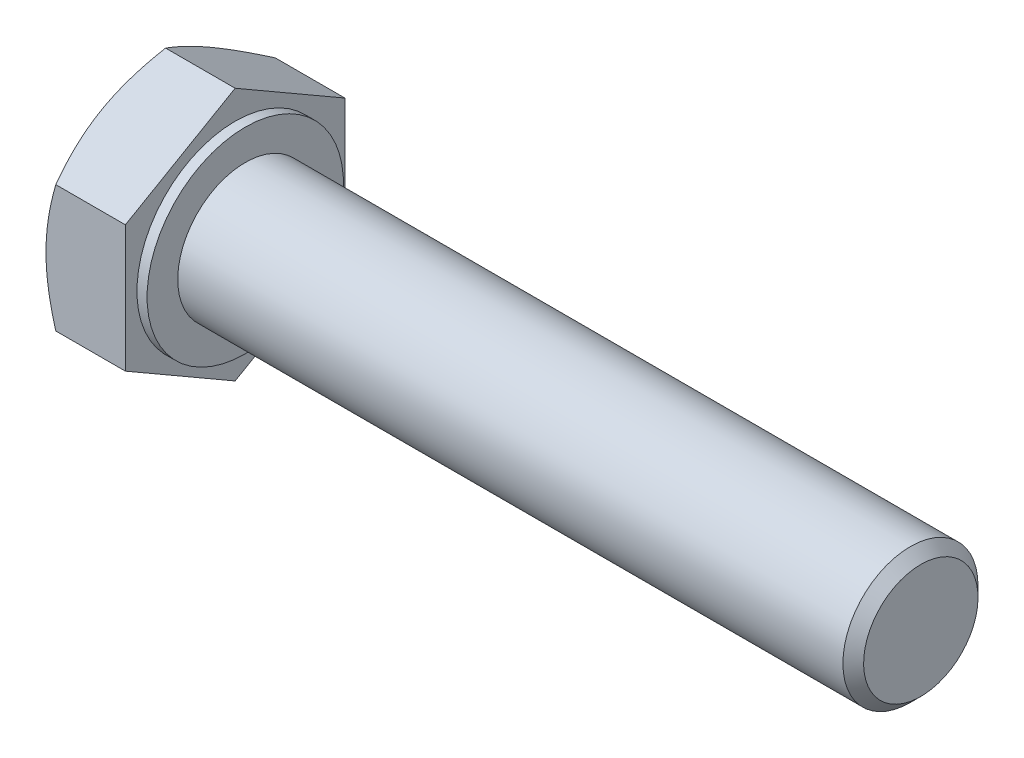
ISO-10303-21;
HEADER;
FILE_DESCRIPTION(('STEP AP214'),'2;1');
FILE_NAME('part.step','',(''),(''),'','','');
FILE_SCHEMA(('AUTOMOTIVE_DESIGN { 1 0 10303 214 1 1 1 1 }'));
ENDSEC;
DATA;
#1=APPLICATION_CONTEXT('core data for automotive mechanical design processes');
#2=APPLICATION_PROTOCOL_DEFINITION('international standard','automotive_design',2000,#1);
#3=PRODUCT_CONTEXT('',#1,'mechanical');
#4=PRODUCT('Part','Part','',(#3));
#5=PRODUCT_RELATED_PRODUCT_CATEGORY('part','',(#4));
#6=PRODUCT_DEFINITION_FORMATION('','',#4);
#7=PRODUCT_DEFINITION_CONTEXT('part definition',#1,'design');
#8=PRODUCT_DEFINITION('design','',#6,#7);
#9=PRODUCT_DEFINITION_SHAPE('','',#8);
#10=(LENGTH_UNIT() NAMED_UNIT(*) SI_UNIT(.MILLI.,.METRE.));
#11=(NAMED_UNIT(*) PLANE_ANGLE_UNIT() SI_UNIT($,.RADIAN.));
#12=(NAMED_UNIT(*) SI_UNIT($,.STERADIAN.) SOLID_ANGLE_UNIT());
#13=UNCERTAINTY_MEASURE_WITH_UNIT(LENGTH_MEASURE(1.E-05),#10,'distance_accuracy_value','');
#14=(GEOMETRIC_REPRESENTATION_CONTEXT(3) GLOBAL_UNCERTAINTY_ASSIGNED_CONTEXT((#13)) GLOBAL_UNIT_ASSIGNED_CONTEXT((#10,
#11,#12)) REPRESENTATION_CONTEXT('',''));
#15=CARTESIAN_POINT('',(0.,0.,0.));
#16=DIRECTION('',(0.,0.,1.));
#17=DIRECTION('',(1.,0.,0.));
#18=AXIS2_PLACEMENT_3D('',#15,#16,#17);
#19=CARTESIAN_POINT('',(0.,4.9075,0.));
#20=DIRECTION('',(1.,0.,0.));
#21=DIRECTION('',(0.,1.,0.));
#22=AXIS2_PLACEMENT_3D('',#19,#20,#21);
#23=PLANE('',#22);
#24=CARTESIAN_POINT('',(0.,0.,0.));
#25=DIRECTION('',(1.,0.,0.));
#26=DIRECTION('',(0.,1.,0.));
#27=AXIS2_PLACEMENT_3D('',#24,#25,#26);
#28=CIRCLE('',#27,4.);
#29=CARTESIAN_POINT('',(0.,-4.,0.));
#30=VERTEX_POINT('',#29);
#31=EDGE_CURVE('E92',#30,#30,#28,.T.);
#32=ORIENTED_EDGE('',*,*,#31,.F.);
#33=EDGE_LOOP('',(#32));
#34=FACE_BOUND('',#33,.T.);
#35=CARTESIAN_POINT('',(0.,0.,0.));
#36=DIRECTION('',(1.,0.,0.));
#37=DIRECTION('',(0.,1.,0.));
#38=AXIS2_PLACEMENT_3D('',#35,#36,#37);
#39=CIRCLE('',#38,5.815);
#40=CARTESIAN_POINT('',(0.,-5.815,0.));
#41=VERTEX_POINT('',#40);
#42=EDGE_CURVE('E28',#41,#41,#39,.T.);
#43=ORIENTED_EDGE('',*,*,#42,.T.);
#44=EDGE_LOOP('',(#43));
#45=FACE_BOUND('',#44,.T.);
#46=ADVANCED_FACE('F17',(#34,#45),#23,.T.);
#47=CARTESIAN_POINT('',(-0.300049999999992,0.,0.));
#48=DIRECTION('',(1.,0.,0.));
#49=DIRECTION('',(0.,1.,0.));
#50=AXIS2_PLACEMENT_3D('',#47,#48,#49);
#51=CYLINDRICAL_SURFACE('',#50,5.815);
#52=ORIENTED_EDGE('',*,*,#42,.F.);
#53=DIRECTION('',(-1.,0.,0.));
#54=VECTOR('',#53,1.);
#55=CARTESIAN_POINT('',(-0.300049999999992,-5.815,0.));
#56=LINE('',#55,#54);
#57=CARTESIAN_POINT('',(-0.600099999999993,-5.815,0.));
#58=VERTEX_POINT('',#57);
#59=EDGE_CURVE('E11',#41,#58,#56,.T.);
#60=ORIENTED_EDGE('',*,*,#59,.T.);
#61=CARTESIAN_POINT('',(-0.600099999999992,0.,0.));
#62=DIRECTION('',(1.,0.,0.));
#63=DIRECTION('',(0.,1.,0.));
#64=AXIS2_PLACEMENT_3D('',#61,#62,#63);
#65=CIRCLE('',#64,5.815);
#66=EDGE_CURVE('E131',#58,#58,#65,.T.);
#67=ORIENTED_EDGE('',*,*,#66,.T.);
#68=ORIENTED_EDGE('',*,*,#59,.F.);
#69=EDGE_LOOP('',(#52,#60,#67,#68));
#70=FACE_BOUND('',#69,.T.);
#71=ADVANCED_FACE('F378',(#70),#51,.T.);
#72=CARTESIAN_POINT('',(-5.3001,0.,0.));
#73=DIRECTION('',(1.,0.,0.));
#74=DIRECTION('',(0.,1.,0.));
#75=AXIS2_PLACEMENT_3D('',#72,#73,#74);
#76=PLANE('',#75);
#77=CARTESIAN_POINT('',(-5.3001,0.,0.));
#78=DIRECTION('',(-1.,0.,0.));
#79=DIRECTION('',(0.,1.,0.));
#80=AXIS2_PLACEMENT_3D('',#77,#78,#79);
#81=CIRCLE('',#80,6.5);
#82=CARTESIAN_POINT('',(-5.3001,0.,6.5));
#83=VERTEX_POINT('',#82);
#84=CARTESIAN_POINT('',(-5.3001,5.62916512459884,3.25));
#85=VERTEX_POINT('',#84);
#86=EDGE_CURVE('E192',#83,#85,#81,.T.);
#87=ORIENTED_EDGE('',*,*,#86,.T.);
#88=CARTESIAN_POINT('',(-5.3001,0.,0.));
#89=DIRECTION('',(-1.,0.,0.));
#90=DIRECTION('',(0.,1.,0.));
#91=AXIS2_PLACEMENT_3D('',#88,#89,#90);
#92=CIRCLE('',#91,6.5);
#93=CARTESIAN_POINT('',(-5.3001,5.62916512459885,-3.25));
#94=VERTEX_POINT('',#93);
#95=EDGE_CURVE('E124',#85,#94,#92,.T.);
#96=ORIENTED_EDGE('',*,*,#95,.T.);
#97=CARTESIAN_POINT('',(-5.3001,0.,0.));
#98=DIRECTION('',(-1.,0.,0.));
#99=DIRECTION('',(0.,1.,0.));
#100=AXIS2_PLACEMENT_3D('',#97,#98,#99);
#101=CIRCLE('',#100,6.5);
#102=CARTESIAN_POINT('',(-5.3001,0.,-6.5));
#103=VERTEX_POINT('',#102);
#104=EDGE_CURVE('E161',#94,#103,#101,.T.);
#105=ORIENTED_EDGE('',*,*,#104,.T.);
#106=CARTESIAN_POINT('',(-5.3001,0.,0.));
#107=DIRECTION('',(-1.,0.,0.));
#108=DIRECTION('',(0.,1.,0.));
#109=AXIS2_PLACEMENT_3D('',#106,#107,#108);
#110=CIRCLE('',#109,6.5);
#111=CARTESIAN_POINT('',(-5.3001,-5.62916512459885,-3.25));
#112=VERTEX_POINT('',#111);
#113=EDGE_CURVE('E214',#103,#112,#110,.T.);
#114=ORIENTED_EDGE('',*,*,#113,.T.);
#115=CARTESIAN_POINT('',(-5.3001,0.,0.));
#116=DIRECTION('',(-1.,0.,0.));
#117=DIRECTION('',(0.,1.,0.));
#118=AXIS2_PLACEMENT_3D('',#115,#116,#117);
#119=CIRCLE('',#118,6.5);
#120=CARTESIAN_POINT('',(-5.3001,-5.62916512459885,3.25));
#121=VERTEX_POINT('',#120);
#122=EDGE_CURVE('E142',#112,#121,#119,.T.);
#123=ORIENTED_EDGE('',*,*,#122,.T.);
#124=CARTESIAN_POINT('',(-5.3001,0.,0.));
#125=DIRECTION('',(-1.,0.,0.));
#126=DIRECTION('',(0.,1.,0.));
#127=AXIS2_PLACEMENT_3D('',#124,#125,#126);
#128=CIRCLE('',#127,6.5);
#129=EDGE_CURVE('E141',#121,#83,#128,.T.);
#130=ORIENTED_EDGE('',*,*,#129,.T.);
#131=EDGE_LOOP('',(#87,#96,#105,#114,#123,#130));
#132=FACE_BOUND('',#131,.T.);
#133=ADVANCED_FACE('F360',(#132),#76,.F.);
#134=CARTESIAN_POINT('',(-0.600099999999993,-7.50555349946513,0.));
#135=DIRECTION('',(0.,-0.866025403784439,-0.5));
#136=DIRECTION('',(0.,0.5,-0.866025403784439));
#137=AXIS2_PLACEMENT_3D('',#134,#135,#136);
#138=PLANE('',#137);
#139=CARTESIAN_POINT('',(-5.3001,-5.62916512459885,-3.25));
#140=CARTESIAN_POINT('',(-5.30010000000001,-4.75833024919771,-4.7583302491977));
#141=CARTESIAN_POINT('',(-4.71954341639926,-3.75277674973258,-6.5));
#142=(BOUNDED_CURVE() B_SPLINE_CURVE(2,(#139,#140,#141),.UNSPECIFIED.,.F.,
.F.) B_SPLINE_CURVE_WITH_KNOTS((3,3),(0.380711317203904,0.761422634407809),
.UNSPECIFIED.) CURVE() GEOMETRIC_REPRESENTATION_ITEM() RATIONAL_B_SPLINE_CURVE((1.,
1.03795484930205,1.)) REPRESENTATION_ITEM(''));
#143=CARTESIAN_POINT('',(-4.71954341639926,-3.75277674973258,-6.5));
#144=VERTEX_POINT('',#143);
#145=EDGE_CURVE('E208',#112,#144,#142,.T.);
#146=ORIENTED_EDGE('',*,*,#145,.T.);
#147=DIRECTION('',(-1.,0.,0.));
#148=VECTOR('',#147,1.);
#149=CARTESIAN_POINT('',(-0.600099999999993,-3.75277674973256,-6.5));
#150=LINE('',#149,#148);
#151=CARTESIAN_POINT('',(-0.600099999999993,-3.75277674973256,-6.5));
#152=VERTEX_POINT('',#151);
#153=EDGE_CURVE('E203',#152,#144,#150,.T.);
#154=ORIENTED_EDGE('',*,*,#153,.F.);
#155=DIRECTION('',(0.,0.5,-0.866025403784439));
#156=VECTOR('',#155,1.);
#157=CARTESIAN_POINT('',(-0.600099999999993,-7.50555349946513,0.));
#158=LINE('',#157,#156);
#159=CARTESIAN_POINT('',(-0.600099999999993,-7.50555349946513,0.));
#160=VERTEX_POINT('',#159);
#161=EDGE_CURVE('E135',#160,#152,#158,.T.);
#162=ORIENTED_EDGE('',*,*,#161,.F.);
#163=DIRECTION('',(-1.,0.,0.));
#164=VECTOR('',#163,1.);
#165=CARTESIAN_POINT('',(-0.600099999999993,-7.50555349946513,0.));
#166=LINE('',#165,#164);
#167=CARTESIAN_POINT('',(-4.71954341639926,-7.50555349946511,0.));
#168=VERTEX_POINT('',#167);
#169=EDGE_CURVE('E129',#160,#168,#166,.T.);
#170=ORIENTED_EDGE('',*,*,#169,.T.);
#171=CARTESIAN_POINT('',(-4.71954341639926,-7.50555349946512,0.));
#172=CARTESIAN_POINT('',(-5.30010000000001,-6.49999999999999,-1.74166975080231));
#173=CARTESIAN_POINT('',(-5.3001,-5.62916512459885,-3.25));
#174=(BOUNDED_CURVE() B_SPLINE_CURVE(2,(#171,#172,#173),.UNSPECIFIED.,.F.,
.F.) B_SPLINE_CURVE_WITH_KNOTS((3,3),(0.,0.380711317203904),
.UNSPECIFIED.) CURVE() GEOMETRIC_REPRESENTATION_ITEM() RATIONAL_B_SPLINE_CURVE((1.,
1.03795484930204,1.)) REPRESENTATION_ITEM(''));
#175=EDGE_CURVE('E123',#168,#112,#174,.T.);
#176=ORIENTED_EDGE('',*,*,#175,.T.);
#177=EDGE_LOOP('',(#146,#154,#162,#170,#176));
#178=FACE_BOUND('',#177,.T.);
#179=ADVANCED_FACE('F408',(#178),#138,.T.);
#180=CARTESIAN_POINT('',(-0.600099999999993,-3.75277674973257,6.5));
#181=DIRECTION('',(0.,-0.866025403784439,0.5));
#182=DIRECTION('',(-1.,0.,0.));
#183=AXIS2_PLACEMENT_3D('',#180,#181,#182);
#184=PLANE('',#183);
#185=CARTESIAN_POINT('',(-5.3001,-5.62916512459885,3.25));
#186=CARTESIAN_POINT('',(-5.30010000000001,-6.5,1.74166975080231));
#187=CARTESIAN_POINT('',(-4.71954341639926,-7.50555349946511,0.));
#188=(BOUNDED_CURVE() B_SPLINE_CURVE(2,(#185,#186,#187),.UNSPECIFIED.,.F.,
.F.) B_SPLINE_CURVE_WITH_KNOTS((3,3),(0.380711317203904,0.761422634407808),
.UNSPECIFIED.) CURVE() GEOMETRIC_REPRESENTATION_ITEM() RATIONAL_B_SPLINE_CURVE((1.,
1.03795484930205,1.)) REPRESENTATION_ITEM(''));
#189=EDGE_CURVE('E149',#121,#168,#188,.T.);
#190=ORIENTED_EDGE('',*,*,#189,.T.);
#191=ORIENTED_EDGE('',*,*,#169,.F.);
#192=DIRECTION('',(0.,-0.5,-0.866025403784439));
#193=VECTOR('',#192,1.);
#194=CARTESIAN_POINT('',(-0.600099999999993,-3.75277674973257,6.5));
#195=LINE('',#194,#193);
#196=CARTESIAN_POINT('',(-0.600099999999993,-3.75277674973257,6.5));
#197=VERTEX_POINT('',#196);
#198=EDGE_CURVE('E202',#197,#160,#195,.T.);
#199=ORIENTED_EDGE('',*,*,#198,.F.);
#200=DIRECTION('',(-1.,0.,0.));
#201=VECTOR('',#200,1.);
#202=CARTESIAN_POINT('',(-0.600099999999993,-3.75277674973257,6.5));
#203=LINE('',#202,#201);
#204=CARTESIAN_POINT('',(-4.71954341639926,-3.75277674973254,6.5));
#205=VERTEX_POINT('',#204);
#206=EDGE_CURVE('E134',#197,#205,#203,.T.);
#207=ORIENTED_EDGE('',*,*,#206,.T.);
#208=CARTESIAN_POINT('',(-4.71954341639926,-3.75277674973259,6.5));
#209=CARTESIAN_POINT('',(-5.30010000000001,-4.75833024919772,4.75833024919769));
#210=CARTESIAN_POINT('',(-5.3001,-5.62916512459885,3.25));
#211=(BOUNDED_CURVE() B_SPLINE_CURVE(2,(#208,#209,#210),.UNSPECIFIED.,.F.,
.F.) B_SPLINE_CURVE_WITH_KNOTS((3,3),(0.,0.380711317203904),
.UNSPECIFIED.) CURVE() GEOMETRIC_REPRESENTATION_ITEM() RATIONAL_B_SPLINE_CURVE((1.,
1.03795484930205,1.)) REPRESENTATION_ITEM(''));
#212=EDGE_CURVE('E191',#205,#121,#211,.T.);
#213=ORIENTED_EDGE('',*,*,#212,.T.);
#214=EDGE_LOOP('',(#190,#191,#199,#207,#213));
#215=FACE_BOUND('',#214,.T.);
#216=ADVANCED_FACE('F292',(#215),#184,.T.);
#217=CARTESIAN_POINT('',(-0.6001,3.75277674973256,6.5));
#218=DIRECTION('',(0.,0.,1.));
#219=DIRECTION('',(0.,-1.,0.));
#220=AXIS2_PLACEMENT_3D('',#217,#218,#219);
#221=PLANE('',#220);
#222=CARTESIAN_POINT('',(-5.3001,0.,6.5));
#223=CARTESIAN_POINT('',(-5.30010000000001,-1.74166975080229,6.49999999999999));
#224=CARTESIAN_POINT('',(-4.71954341639926,-3.75277674973254,6.5));
#225=(BOUNDED_CURVE() B_SPLINE_CURVE(2,(#222,#223,#224),.UNSPECIFIED.,.F.,
.F.) B_SPLINE_CURVE_WITH_KNOTS((3,3),(0.380711317203905,0.76142263440781),
.UNSPECIFIED.) CURVE() GEOMETRIC_REPRESENTATION_ITEM() RATIONAL_B_SPLINE_CURVE((1.,
1.03795484930202,1.)) REPRESENTATION_ITEM(''));
#226=EDGE_CURVE('E244',#83,#205,#225,.T.);
#227=ORIENTED_EDGE('',*,*,#226,.T.);
#228=ORIENTED_EDGE('',*,*,#206,.F.);
#229=DIRECTION('',(0.,-1.,0.));
#230=VECTOR('',#229,1.);
#231=CARTESIAN_POINT('',(-0.6001,3.75277674973256,6.5));
#232=LINE('',#231,#230);
#233=CARTESIAN_POINT('',(-0.6001,3.75277674973256,6.5));
#234=VERTEX_POINT('',#233);
#235=EDGE_CURVE('E262',#234,#197,#232,.T.);
#236=ORIENTED_EDGE('',*,*,#235,.F.);
#237=DIRECTION('',(-1.,0.,0.));
#238=VECTOR('',#237,1.);
#239=CARTESIAN_POINT('',(-0.6001,3.75277674973256,6.5));
#240=LINE('',#239,#238);
#241=CARTESIAN_POINT('',(-4.71954341639926,3.75277674973253,6.5));
#242=VERTEX_POINT('',#241);
#243=EDGE_CURVE('E177',#234,#242,#240,.T.);
#244=ORIENTED_EDGE('',*,*,#243,.T.);
#245=CARTESIAN_POINT('',(-4.71954341639926,3.75277674973253,6.5));
#246=CARTESIAN_POINT('',(-5.30010000000001,1.74166975080228,6.5));
#247=CARTESIAN_POINT('',(-5.3001,0.,6.5));
#248=(BOUNDED_CURVE() B_SPLINE_CURVE(2,(#245,#246,#247),.UNSPECIFIED.,.F.,
.F.) B_SPLINE_CURVE_WITH_KNOTS((3,3),(0.,0.380711317203905),
.UNSPECIFIED.) CURVE() GEOMETRIC_REPRESENTATION_ITEM() RATIONAL_B_SPLINE_CURVE((1.,
1.03795484930204,1.)) REPRESENTATION_ITEM(''));
#249=EDGE_CURVE('E185',#242,#83,#248,.T.);
#250=ORIENTED_EDGE('',*,*,#249,.T.);
#251=EDGE_LOOP('',(#227,#228,#236,#244,#250));
#252=FACE_BOUND('',#251,.T.);
#253=ADVANCED_FACE('F331',(#252),#221,.T.);
#254=CARTESIAN_POINT('',(-0.6001,0.,0.));
#255=DIRECTION('',(1.,0.,0.));
#256=DIRECTION('',(0.,1.,0.));
#257=AXIS2_PLACEMENT_3D('',#254,#255,#256);
#258=PLANE('',#257);
#259=ORIENTED_EDGE('',*,*,#66,.F.);
#260=EDGE_LOOP('',(#259));
#261=FACE_BOUND('',#260,.T.);
#262=DIRECTION('',(0.,-0.5,0.866025403784438));
#263=VECTOR('',#262,1.);
#264=CARTESIAN_POINT('',(-0.6001,7.50555349946513,0.));
#265=LINE('',#264,#263);
#266=CARTESIAN_POINT('',(-0.6001,7.50555349946513,0.));
#267=VERTEX_POINT('',#266);
#268=EDGE_CURVE('E184',#267,#234,#265,.T.);
#269=ORIENTED_EDGE('',*,*,#268,.T.);
#270=ORIENTED_EDGE('',*,*,#235,.T.);
#271=ORIENTED_EDGE('',*,*,#198,.T.);
#272=ORIENTED_EDGE('',*,*,#161,.T.);
#273=DIRECTION('',(0.,1.,0.));
#274=VECTOR('',#273,1.);
#275=CARTESIAN_POINT('',(-0.600099999999993,-3.75277674973256,-6.5));
#276=LINE('',#275,#274);
#277=CARTESIAN_POINT('',(-0.6001,3.75277674973256,-6.5));
#278=VERTEX_POINT('',#277);
#279=EDGE_CURVE('E207',#152,#278,#276,.T.);
#280=ORIENTED_EDGE('',*,*,#279,.T.);
#281=DIRECTION('',(0.,0.5,0.866025403784439));
#282=VECTOR('',#281,1.);
#283=CARTESIAN_POINT('',(-0.6001,3.75277674973256,-6.5));
#284=LINE('',#283,#282);
#285=EDGE_CURVE('E21',#278,#267,#284,.T.);
#286=ORIENTED_EDGE('',*,*,#285,.T.);
#287=EDGE_LOOP('',(#269,#270,#271,#272,#280,#286));
#288=FACE_BOUND('',#287,.T.);
#289=ADVANCED_FACE('F287',(#261,#288),#258,.T.);
#290=CARTESIAN_POINT('',(-0.6001,7.50555349946513,0.));
#291=DIRECTION('',(0.,0.866025403784438,0.5));
#292=DIRECTION('',(1.,0.,0.));
#293=AXIS2_PLACEMENT_3D('',#290,#291,#292);
#294=PLANE('',#293);
#295=CARTESIAN_POINT('',(-4.71954341639926,7.50555349946512,0.));
#296=CARTESIAN_POINT('',(-5.30010000000001,6.5,1.74166975080231));
#297=CARTESIAN_POINT('',(-5.3001,5.62916512459884,3.25));
#298=(BOUNDED_CURVE() B_SPLINE_CURVE(2,(#295,#296,#297),.UNSPECIFIED.,.F.,
.F.) B_SPLINE_CURVE_WITH_KNOTS((3,3),(0.,0.380711317203905),
.UNSPECIFIED.) CURVE() GEOMETRIC_REPRESENTATION_ITEM() RATIONAL_B_SPLINE_CURVE((1.,
1.03795484930205,1.)) REPRESENTATION_ITEM(''));
#299=CARTESIAN_POINT('',(-4.71954341639926,7.50555349946511,0.));
#300=VERTEX_POINT('',#299);
#301=EDGE_CURVE('E117',#300,#85,#298,.T.);
#302=ORIENTED_EDGE('',*,*,#301,.T.);
#303=CARTESIAN_POINT('',(-5.3001,5.62916512459884,3.25));
#304=CARTESIAN_POINT('',(-5.30010000000002,4.7583302491977,4.75833024919769));
#305=CARTESIAN_POINT('',(-4.71954341639926,3.75277674973257,6.5));
#306=(BOUNDED_CURVE() B_SPLINE_CURVE(2,(#303,#304,#305),.UNSPECIFIED.,.F.,
.F.) B_SPLINE_CURVE_WITH_KNOTS((3,3),(0.380711317203905,0.76142263440781),
.UNSPECIFIED.) CURVE() GEOMETRIC_REPRESENTATION_ITEM() RATIONAL_B_SPLINE_CURVE((1.,
1.03795484930203,1.)) REPRESENTATION_ITEM(''));
#307=EDGE_CURVE('E198',#85,#242,#306,.T.);
#308=ORIENTED_EDGE('',*,*,#307,.T.);
#309=ORIENTED_EDGE('',*,*,#243,.F.);
#310=ORIENTED_EDGE('',*,*,#268,.F.);
#311=DIRECTION('',(-1.,0.,0.));
#312=VECTOR('',#311,1.);
#313=CARTESIAN_POINT('',(-0.6001,7.50555349946513,0.));
#314=LINE('',#313,#312);
#315=EDGE_CURVE('E206',#267,#300,#314,.T.);
#316=ORIENTED_EDGE('',*,*,#315,.T.);
#317=EDGE_LOOP('',(#302,#308,#309,#310,#316));
#318=FACE_BOUND('',#317,.T.);
#319=ADVANCED_FACE('F339',(#318),#294,.T.);
#320=CARTESIAN_POINT('',(-0.6001,3.75277674973256,-6.5));
#321=DIRECTION('',(0.,0.866025403784439,-0.5));
#322=DIRECTION('',(-1.,0.,0.));
#323=AXIS2_PLACEMENT_3D('',#320,#321,#322);
#324=PLANE('',#323);
#325=CARTESIAN_POINT('',(-4.71954341639926,3.75277674973258,-6.5));
#326=CARTESIAN_POINT('',(-5.30010000000001,4.75833024919771,-4.7583302491977));
#327=CARTESIAN_POINT('',(-5.3001,5.62916512459885,-3.25));
#328=(BOUNDED_CURVE() B_SPLINE_CURVE(2,(#325,#326,#327),.UNSPECIFIED.,.F.,
.F.) B_SPLINE_CURVE_WITH_KNOTS((3,3),(0.,0.380711317203905),
.UNSPECIFIED.) CURVE() GEOMETRIC_REPRESENTATION_ITEM() RATIONAL_B_SPLINE_CURVE((1.,
1.03795484930205,1.)) REPRESENTATION_ITEM(''));
#329=CARTESIAN_POINT('',(-4.71954341639926,3.75277674973253,-6.5));
#330=VERTEX_POINT('',#329);
#331=EDGE_CURVE('E229',#330,#94,#328,.T.);
#332=ORIENTED_EDGE('',*,*,#331,.T.);
#333=CARTESIAN_POINT('',(-5.3001,5.62916512459885,-3.25));
#334=CARTESIAN_POINT('',(-5.30010000000001,6.49999999999999,-1.74166975080229));
#335=CARTESIAN_POINT('',(-4.71954341639926,7.50555349946511,0.));
#336=(BOUNDED_CURVE() B_SPLINE_CURVE(2,(#333,#334,#335),.UNSPECIFIED.,.F.,
.F.) B_SPLINE_CURVE_WITH_KNOTS((3,3),(0.380711317203905,0.76142263440781),
.UNSPECIFIED.) CURVE() GEOMETRIC_REPRESENTATION_ITEM() RATIONAL_B_SPLINE_CURVE((1.,
1.03795484930206,1.)) REPRESENTATION_ITEM(''));
#337=EDGE_CURVE('E136',#94,#300,#336,.T.);
#338=ORIENTED_EDGE('',*,*,#337,.T.);
#339=ORIENTED_EDGE('',*,*,#315,.F.);
#340=ORIENTED_EDGE('',*,*,#285,.F.);
#341=DIRECTION('',(-1.,0.,0.));
#342=VECTOR('',#341,1.);
#343=CARTESIAN_POINT('',(-0.6001,3.75277674973256,-6.5));
#344=LINE('',#343,#342);
#345=EDGE_CURVE('E240',#278,#330,#344,.T.);
#346=ORIENTED_EDGE('',*,*,#345,.T.);
#347=EDGE_LOOP('',(#332,#338,#339,#340,#346));
#348=FACE_BOUND('',#347,.T.);
#349=ADVANCED_FACE('F402',(#348),#324,.T.);
#350=CARTESIAN_POINT('',(-0.600099999999993,-3.75277674973256,-6.5));
#351=DIRECTION('',(0.,0.,-1.));
#352=DIRECTION('',(-1.,0.,0.));
#353=AXIS2_PLACEMENT_3D('',#350,#351,#352);
#354=PLANE('',#353);
#355=CARTESIAN_POINT('',(-4.71954341639926,-3.75277674973253,-6.5));
#356=CARTESIAN_POINT('',(-5.30010000000001,-1.74166975080229,-6.5));
#357=CARTESIAN_POINT('',(-5.3001,0.,-6.5));
#358=(BOUNDED_CURVE() B_SPLINE_CURVE(2,(#355,#356,#357),.UNSPECIFIED.,.F.,
.F.) B_SPLINE_CURVE_WITH_KNOTS((3,3),(0.,0.380711317203905),
.UNSPECIFIED.) CURVE() GEOMETRIC_REPRESENTATION_ITEM() RATIONAL_B_SPLINE_CURVE((1.,
1.03795484930204,1.)) REPRESENTATION_ITEM(''));
#359=EDGE_CURVE('E113',#144,#103,#358,.T.);
#360=ORIENTED_EDGE('',*,*,#359,.T.);
#361=CARTESIAN_POINT('',(-5.3001,0.,-6.5));
#362=CARTESIAN_POINT('',(-5.30010000000001,1.74166975080229,-6.5));
#363=CARTESIAN_POINT('',(-4.71954341639926,3.75277674973254,-6.5));
#364=(BOUNDED_CURVE() B_SPLINE_CURVE(2,(#361,#362,#363),.UNSPECIFIED.,.F.,
.F.) B_SPLINE_CURVE_WITH_KNOTS((3,3),(0.380711317203905,0.761422634407809),
.UNSPECIFIED.) CURVE() GEOMETRIC_REPRESENTATION_ITEM() RATIONAL_B_SPLINE_CURVE((1.,
1.03795484930204,1.)) REPRESENTATION_ITEM(''));
#365=EDGE_CURVE('E148',#103,#330,#364,.T.);
#366=ORIENTED_EDGE('',*,*,#365,.T.);
#367=ORIENTED_EDGE('',*,*,#345,.F.);
#368=ORIENTED_EDGE('',*,*,#279,.F.);
#369=ORIENTED_EDGE('',*,*,#153,.T.);
#370=EDGE_LOOP('',(#360,#366,#367,#368,#369));
#371=FACE_BOUND('',#370,.T.);
#372=ADVANCED_FACE('F394',(#371),#354,.T.);
#373=CARTESIAN_POINT('',(-5.00982170819963,0.,0.));
#374=DIRECTION('',(1.,0.,0.));
#375=DIRECTION('',(0.,1.,0.));
#376=AXIS2_PLACEMENT_3D('',#373,#374,#375);
#377=CONICAL_SURFACE('',#376,7.00277674973256,1.0471975511966);
#378=ORIENTED_EDGE('',*,*,#359,.F.);
#379=ORIENTED_EDGE('',*,*,#145,.F.);
#380=ORIENTED_EDGE('',*,*,#113,.F.);
#381=EDGE_LOOP('',(#378,#379,#380));
#382=FACE_BOUND('',#381,.T.);
#383=ADVANCED_FACE('F390',(#382),#377,.T.);
#384=CARTESIAN_POINT('',(-5.00982170819963,0.,0.));
#385=DIRECTION('',(1.,0.,0.));
#386=DIRECTION('',(0.,1.,0.));
#387=AXIS2_PLACEMENT_3D('',#384,#385,#386);
#388=CONICAL_SURFACE('',#387,7.00277674973256,1.0471975511966);
#389=ORIENTED_EDGE('',*,*,#365,.F.);
#390=ORIENTED_EDGE('',*,*,#104,.F.);
#391=ORIENTED_EDGE('',*,*,#331,.F.);
#392=EDGE_LOOP('',(#389,#390,#391));
#393=FACE_BOUND('',#392,.T.);
#394=ADVANCED_FACE('F393',(#393),#388,.T.);
#395=CARTESIAN_POINT('',(-5.00982170819963,0.,0.));
#396=DIRECTION('',(1.,0.,0.));
#397=DIRECTION('',(0.,-1.,0.));
#398=AXIS2_PLACEMENT_3D('',#395,#396,#397);
#399=CONICAL_SURFACE('',#398,7.00277674973256,1.0471975511966);
#400=ORIENTED_EDGE('',*,*,#175,.F.);
#401=ORIENTED_EDGE('',*,*,#189,.F.);
#402=ORIENTED_EDGE('',*,*,#122,.F.);
#403=EDGE_LOOP('',(#400,#401,#402));
#404=FACE_BOUND('',#403,.T.);
#405=ADVANCED_FACE('F373',(#404),#399,.T.);
#406=CARTESIAN_POINT('',(-5.00982170819963,0.,0.));
#407=DIRECTION('',(1.,0.,0.));
#408=DIRECTION('',(0.,1.,0.));
#409=AXIS2_PLACEMENT_3D('',#406,#407,#408);
#410=CONICAL_SURFACE('',#409,7.00277674973256,1.0471975511966);
#411=ORIENTED_EDGE('',*,*,#337,.F.);
#412=ORIENTED_EDGE('',*,*,#95,.F.);
#413=ORIENTED_EDGE('',*,*,#301,.F.);
#414=EDGE_LOOP('',(#411,#412,#413));
#415=FACE_BOUND('',#414,.T.);
#416=ADVANCED_FACE('F19',(#415),#410,.T.);
#417=CARTESIAN_POINT('',(-5.00982170819963,0.,0.));
#418=DIRECTION('',(1.,0.,0.));
#419=DIRECTION('',(0.,1.,0.));
#420=AXIS2_PLACEMENT_3D('',#417,#418,#419);
#421=CONICAL_SURFACE('',#420,7.00277674973256,1.0471975511966);
#422=ORIENTED_EDGE('',*,*,#212,.F.);
#423=ORIENTED_EDGE('',*,*,#226,.F.);
#424=ORIENTED_EDGE('',*,*,#129,.F.);
#425=EDGE_LOOP('',(#422,#423,#424));
#426=FACE_BOUND('',#425,.T.);
#427=ADVANCED_FACE('F363',(#426),#421,.T.);
#428=CARTESIAN_POINT('',(-5.00982170819963,0.,0.));
#429=DIRECTION('',(1.,0.,0.));
#430=DIRECTION('',(0.,1.,0.));
#431=AXIS2_PLACEMENT_3D('',#428,#429,#430);
#432=CONICAL_SURFACE('',#431,7.00277674973256,1.0471975511966);
#433=ORIENTED_EDGE('',*,*,#307,.F.);
#434=ORIENTED_EDGE('',*,*,#86,.F.);
#435=ORIENTED_EDGE('',*,*,#249,.F.);
#436=EDGE_LOOP('',(#433,#434,#435));
#437=FACE_BOUND('',#436,.T.);
#438=ADVANCED_FACE('F337',(#437),#432,.T.);
#439=CARTESIAN_POINT('',(40.,2.,0.));
#440=DIRECTION('',(1.,0.,0.));
#441=DIRECTION('',(0.,1.,0.));
#442=AXIS2_PLACEMENT_3D('',#439,#440,#441);
#443=PLANE('',#442);
#444=CARTESIAN_POINT('',(40.,0.,0.));
#445=DIRECTION('',(-1.,0.,0.));
#446=DIRECTION('',(0.,-1.,0.));
#447=AXIS2_PLACEMENT_3D('',#444,#445,#446);
#448=CIRCLE('',#447,3.38655);
#449=CARTESIAN_POINT('',(40.,3.38655,0.));
#450=VERTEX_POINT('',#449);
#451=EDGE_CURVE('E109',#450,#450,#448,.T.);
#452=ORIENTED_EDGE('',*,*,#451,.F.);
#453=EDGE_LOOP('',(#452));
#454=FACE_BOUND('',#453,.T.);
#455=ADVANCED_FACE('F371',(#454),#443,.T.);
#456=CARTESIAN_POINT('',(29.,0.,0.));
#457=DIRECTION('',(1.,0.,0.));
#458=DIRECTION('',(0.,1.,0.));
#459=AXIS2_PLACEMENT_3D('',#456,#457,#458);
#460=CYLINDRICAL_SURFACE('',#459,4.);
#461=CARTESIAN_POINT('',(39.38645,0.,0.));
#462=DIRECTION('',(1.,0.,0.));
#463=DIRECTION('',(0.,-1.,0.));
#464=AXIS2_PLACEMENT_3D('',#461,#462,#463);
#465=CIRCLE('',#464,4.);
#466=CARTESIAN_POINT('',(39.38645,4.,0.));
#467=VERTEX_POINT('',#466);
#468=CARTESIAN_POINT('',(39.38645,-4.,0.));
#469=VERTEX_POINT('',#468);
#470=EDGE_CURVE('E89',#467,#469,#465,.T.);
#471=ORIENTED_EDGE('',*,*,#470,.F.);
#472=CARTESIAN_POINT('',(39.38645,0.,0.));
#473=DIRECTION('',(1.,0.,0.));
#474=DIRECTION('',(0.,-1.,0.));
#475=AXIS2_PLACEMENT_3D('',#472,#473,#474);
#476=CIRCLE('',#475,4.);
#477=EDGE_CURVE('E94',#469,#467,#476,.T.);
#478=ORIENTED_EDGE('',*,*,#477,.F.);
#479=DIRECTION('',(-1.,0.,0.));
#480=VECTOR('',#479,1.);
#481=CARTESIAN_POINT('',(29.,-4.,0.));
#482=LINE('',#481,#480);
#483=EDGE_CURVE('E85',#469,#30,#482,.T.);
#484=ORIENTED_EDGE('',*,*,#483,.T.);
#485=ORIENTED_EDGE('',*,*,#31,.T.);
#486=ORIENTED_EDGE('',*,*,#483,.F.);
#487=EDGE_LOOP('',(#471,#478,#484,#485,#486));
#488=FACE_BOUND('',#487,.T.);
#489=ADVANCED_FACE('F87',(#488),#460,.T.);
#490=CARTESIAN_POINT('',(39.693225,0.,0.));
#491=DIRECTION('',(-1.,0.,0.));
#492=DIRECTION('',(0.,-1.,0.));
#493=AXIS2_PLACEMENT_3D('',#490,#491,#492);
#494=CONICAL_SURFACE('',#493,3.693275,0.785316663805127);
#495=ORIENTED_EDGE('',*,*,#451,.T.);
#496=DIRECTION('',(-0.707164407752512,0.70704914992385,0.));
#497=VECTOR('',#496,1.);
#498=CARTESIAN_POINT('',(39.693225,3.693275,0.));
#499=LINE('',#498,#497);
#500=EDGE_CURVE('E102',#450,#467,#499,.T.);
#501=ORIENTED_EDGE('',*,*,#500,.T.);
#502=ORIENTED_EDGE('',*,*,#470,.T.);
#503=ORIENTED_EDGE('',*,*,#477,.T.);
#504=ORIENTED_EDGE('',*,*,#500,.F.);
#505=EDGE_LOOP('',(#495,#501,#502,#503,#504));
#506=FACE_BOUND('',#505,.T.);
#507=ADVANCED_FACE('F101',(#506),#494,.T.);
#508=CLOSED_SHELL('',(#46,#71,#133,#179,#216,#253,#289,#319,#349,#372,#383,#394,#405,#416,#427,
#438,#455,#489,#507));
#509=MANIFOLD_SOLID_BREP('B1',#508);
#510=ADVANCED_BREP_SHAPE_REPRESENTATION('',(#18,#509),#14);
#511=SHAPE_DEFINITION_REPRESENTATION(#9,#510);
ENDSEC;
END-ISO-10303-21;
